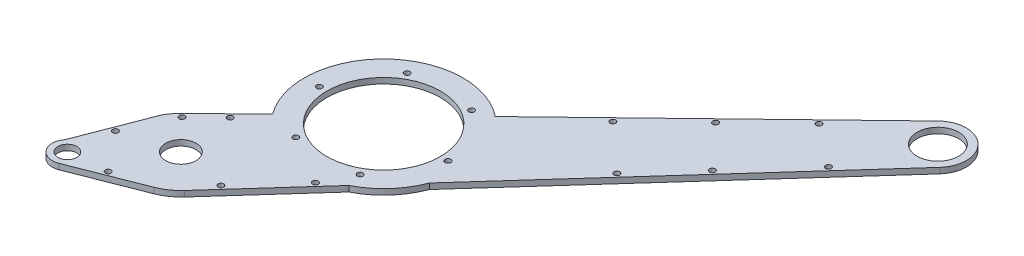
ISO-10303-21;
HEADER;
FILE_DESCRIPTION(('STEP AP214'),'2;1');
FILE_NAME('part.step','',(''),(''),'','','');
FILE_SCHEMA(('AUTOMOTIVE_DESIGN { 1 0 10303 214 1 1 1 1 }'));
ENDSEC;
DATA;
#1=APPLICATION_CONTEXT('core data for automotive mechanical design processes');
#2=APPLICATION_PROTOCOL_DEFINITION('international standard','automotive_design',2000,#1);
#3=PRODUCT_CONTEXT('',#1,'mechanical');
#4=PRODUCT('Part','Part','',(#3));
#5=PRODUCT_RELATED_PRODUCT_CATEGORY('part','',(#4));
#6=PRODUCT_DEFINITION_FORMATION('','',#4);
#7=PRODUCT_DEFINITION_CONTEXT('part definition',#1,'design');
#8=PRODUCT_DEFINITION('design','',#6,#7);
#9=PRODUCT_DEFINITION_SHAPE('','',#8);
#10=(LENGTH_UNIT() NAMED_UNIT(*) SI_UNIT(.MILLI.,.METRE.));
#11=(NAMED_UNIT(*) PLANE_ANGLE_UNIT() SI_UNIT($,.RADIAN.));
#12=(NAMED_UNIT(*) SI_UNIT($,.STERADIAN.) SOLID_ANGLE_UNIT());
#13=UNCERTAINTY_MEASURE_WITH_UNIT(LENGTH_MEASURE(1.E-05),#10,'distance_accuracy_value','');
#14=(GEOMETRIC_REPRESENTATION_CONTEXT(3) GLOBAL_UNCERTAINTY_ASSIGNED_CONTEXT((#13)) GLOBAL_UNIT_ASSIGNED_CONTEXT((#10,
#11,#12)) REPRESENTATION_CONTEXT('',''));
#15=CARTESIAN_POINT('',(0.,0.,0.));
#16=DIRECTION('',(0.,0.,1.));
#17=DIRECTION('',(1.,0.,0.));
#18=AXIS2_PLACEMENT_3D('',#15,#16,#17);
#19=CARTESIAN_POINT('',(40.6989429108541,3.,-66.4645055499677));
#20=DIRECTION('',(0.,-1.,0.));
#21=DIRECTION('',(0.,0.,1.));
#22=AXIS2_PLACEMENT_3D('',#19,#20,#21);
#23=CYLINDRICAL_SURFACE('',#22,42.);
#24=CARTESIAN_POINT('',(40.6989429108541,0.,-66.4645055499677));
#25=DIRECTION('',(0.,-1.,0.));
#26=DIRECTION('',(0.,0.,-1.));
#27=AXIS2_PLACEMENT_3D('',#24,#25,#26);
#28=CIRCLE('',#27,42.);
#29=CARTESIAN_POINT('',(6.95401125447119,0.,-41.4589144250603));
#30=VERTEX_POINT('',#29);
#31=CARTESIAN_POINT('',(66.8817826108157,0.,-99.3044036199391));
#32=VERTEX_POINT('',#31);
#33=EDGE_CURVE('E192',#30,#32,#28,.T.);
#34=ORIENTED_EDGE('',*,*,#33,.F.);
#35=DIRECTION('',(0.,-1.,0.));
#36=VECTOR('',#35,1.);
#37=CARTESIAN_POINT('',(6.95401125447119,3.,-41.4589144250603));
#38=LINE('',#37,#36);
#39=CARTESIAN_POINT('',(6.95401125447119,3.,-41.4589144250603));
#40=VERTEX_POINT('',#39);
#41=EDGE_CURVE('E191',#40,#30,#38,.T.);
#42=ORIENTED_EDGE('',*,*,#41,.F.);
#43=CARTESIAN_POINT('',(40.6989429108541,3.,-66.4645055499677));
#44=DIRECTION('',(0.,-1.,0.));
#45=DIRECTION('',(0.,0.,-1.));
#46=AXIS2_PLACEMENT_3D('',#43,#44,#45);
#47=CIRCLE('',#46,42.);
#48=CARTESIAN_POINT('',(66.8817826108157,3.,-99.3044036199391));
#49=VERTEX_POINT('',#48);
#50=EDGE_CURVE('E248',#40,#49,#47,.T.);
#51=ORIENTED_EDGE('',*,*,#50,.T.);
#52=DIRECTION('',(0.,-1.,0.));
#53=VECTOR('',#52,1.);
#54=CARTESIAN_POINT('',(66.8817826108157,3.,-99.3044036199391));
#55=LINE('',#54,#53);
#56=EDGE_CURVE('E11',#49,#32,#55,.T.);
#57=ORIENTED_EDGE('',*,*,#56,.T.);
#58=EDGE_LOOP('',(#34,#42,#51,#57));
#59=FACE_BOUND('',#58,.T.);
#60=ADVANCED_FACE('F38',(#59),#23,.T.);
#61=CARTESIAN_POINT('',(-17.3624071779741,3.,-17.9874071779741));
#62=DIRECTION('',(0.694496287118964,0.,0.719496287118964));
#63=DIRECTION('',(-0.719496287118964,0.,0.694496287118964));
#64=AXIS2_PLACEMENT_3D('',#61,#62,#63);
#65=PLANE('',#64);
#66=DIRECTION('',(0.719496287118964,0.,-0.694496287118963));
#67=VECTOR('',#66,1.);
#68=CARTESIAN_POINT('',(-17.3624071779741,0.,-17.9874071779741));
#69=LINE('',#68,#67);
#70=CARTESIAN_POINT('',(186.110074257621,0.,-214.389925742379));
#71=VERTEX_POINT('',#70);
#72=EDGE_CURVE('E194',#32,#71,#69,.T.);
#73=ORIENTED_EDGE('',*,*,#72,.F.);
#74=ORIENTED_EDGE('',*,*,#56,.F.);
#75=DIRECTION('',(0.719496287118964,0.,-0.694496287118963));
#76=VECTOR('',#75,1.);
#77=CARTESIAN_POINT('',(-17.3624071779741,3.,-17.9874071779741));
#78=LINE('',#77,#76);
#79=CARTESIAN_POINT('',(186.110074257621,3.,-214.389925742379));
#80=VERTEX_POINT('',#79);
#81=EDGE_CURVE('E106',#49,#80,#78,.T.);
#82=ORIENTED_EDGE('',*,*,#81,.T.);
#83=DIRECTION('',(0.,-1.,0.));
#84=VECTOR('',#83,1.);
#85=CARTESIAN_POINT('',(186.110074257621,3.,-214.389925742379));
#86=LINE('',#85,#84);
#87=EDGE_CURVE('E47',#80,#71,#86,.T.);
#88=ORIENTED_EDGE('',*,*,#87,.T.);
#89=EDGE_LOOP('',(#73,#74,#82,#88));
#90=FACE_BOUND('',#89,.T.);
#91=ADVANCED_FACE('F374',(#90),#65,.F.);
#92=CARTESIAN_POINT('',(196.527518564405,3.,-203.597481435595));
#93=DIRECTION('',(0.,-1.,0.));
#94=DIRECTION('',(0.,0.,1.));
#95=AXIS2_PLACEMENT_3D('',#92,#93,#94);
#96=CYLINDRICAL_SURFACE('',#95,15.);
#97=CARTESIAN_POINT('',(196.527518564405,0.,-203.597481435595));
#98=DIRECTION('',(0.,-1.,0.));
#99=DIRECTION('',(0.,0.,-1.));
#100=AXIS2_PLACEMENT_3D('',#97,#98,#99);
#101=CIRCLE('',#100,15.);
#102=CARTESIAN_POINT('',(207.681250795877,0.,-193.567812582206));
#103=VERTEX_POINT('',#102);
#104=EDGE_CURVE('E197',#71,#103,#101,.T.);
#105=ORIENTED_EDGE('',*,*,#104,.F.);
#106=ORIENTED_EDGE('',*,*,#87,.F.);
#107=CARTESIAN_POINT('',(196.527518564405,3.,-203.597481435595));
#108=DIRECTION('',(0.,-1.,0.));
#109=DIRECTION('',(0.,0.,-1.));
#110=AXIS2_PLACEMENT_3D('',#107,#108,#109);
#111=CIRCLE('',#110,15.);
#112=CARTESIAN_POINT('',(207.681250795877,3.,-193.567812582206));
#113=VERTEX_POINT('',#112);
#114=EDGE_CURVE('E388',#80,#113,#111,.T.);
#115=ORIENTED_EDGE('',*,*,#114,.T.);
#116=DIRECTION('',(0.,-1.,0.));
#117=VECTOR('',#116,1.);
#118=CARTESIAN_POINT('',(207.681250795877,3.,-193.567812582206));
#119=LINE('',#118,#117);
#120=EDGE_CURVE('E267',#113,#103,#119,.T.);
#121=ORIENTED_EDGE('',*,*,#120,.T.);
#122=EDGE_LOOP('',(#105,#106,#115,#121));
#123=FACE_BOUND('',#122,.T.);
#124=ADVANCED_FACE('F379',(#123),#96,.T.);
#125=CARTESIAN_POINT('',(18.5895537191193,3.,16.7161147556476));
#126=DIRECTION('',(0.743582148764772,0.,0.668644590225902));
#127=DIRECTION('',(-0.668644590225902,0.,0.743582148764772));
#128=AXIS2_PLACEMENT_3D('',#125,#126,#127);
#129=PLANE('',#128);
#130=DIRECTION('',(0.668644590225902,0.,-0.743582148764772));
#131=VECTOR('',#130,1.);
#132=CARTESIAN_POINT('',(18.5895537191193,0.,16.7161147556476));
#133=LINE('',#132,#131);
#134=CARTESIAN_POINT('',(79.9511725799714,0.,-51.5225355994269));
#135=VERTEX_POINT('',#134);
#136=EDGE_CURVE('E200',#135,#103,#133,.T.);
#137=ORIENTED_EDGE('',*,*,#136,.T.);
#138=ORIENTED_EDGE('',*,*,#120,.F.);
#139=DIRECTION('',(0.668644590225902,0.,-0.743582148764772));
#140=VECTOR('',#139,1.);
#141=CARTESIAN_POINT('',(18.5895537191193,3.,16.7161147556476));
#142=LINE('',#141,#140);
#143=CARTESIAN_POINT('',(79.9511725799714,3.,-51.5225355994269));
#144=VERTEX_POINT('',#143);
#145=EDGE_CURVE('E392',#144,#113,#142,.T.);
#146=ORIENTED_EDGE('',*,*,#145,.F.);
#147=DIRECTION('',(0.,-1.,0.));
#148=VECTOR('',#147,1.);
#149=CARTESIAN_POINT('',(79.9511725799714,3.,-51.5225355994269));
#150=LINE('',#149,#148);
#151=EDGE_CURVE('E264',#144,#135,#150,.T.);
#152=ORIENTED_EDGE('',*,*,#151,.T.);
#153=EDGE_LOOP('',(#137,#138,#146,#152));
#154=FACE_BOUND('',#153,.T.);
#155=ADVANCED_FACE('F391',(#154),#129,.T.);
#156=CARTESIAN_POINT('',(40.6989429108541,3.,-66.4645055499677));
#157=DIRECTION('',(0.,-1.,0.));
#158=DIRECTION('',(0.,0.,1.));
#159=AXIS2_PLACEMENT_3D('',#156,#157,#158);
#160=CYLINDRICAL_SURFACE('',#159,42.);
#161=CARTESIAN_POINT('',(40.6989429108541,0.,-66.4645055499677));
#162=DIRECTION('',(0.,-1.,0.));
#163=DIRECTION('',(0.,0.,-1.));
#164=AXIS2_PLACEMENT_3D('',#161,#162,#163);
#165=CIRCLE('',#164,42.);
#166=CARTESIAN_POINT('',(59.7110214741794,0.,-29.0139932877576));
#167=VERTEX_POINT('',#166);
#168=EDGE_CURVE('E202',#135,#167,#165,.T.);
#169=ORIENTED_EDGE('',*,*,#168,.F.);
#170=ORIENTED_EDGE('',*,*,#151,.F.);
#171=CARTESIAN_POINT('',(40.6989429108541,3.,-66.4645055499677));
#172=DIRECTION('',(0.,-1.,0.));
#173=DIRECTION('',(0.,0.,-1.));
#174=AXIS2_PLACEMENT_3D('',#171,#172,#173);
#175=CIRCLE('',#174,42.);
#176=CARTESIAN_POINT('',(59.7110214741794,3.,-29.0139932877576));
#177=VERTEX_POINT('',#176);
#178=EDGE_CURVE('E397',#144,#177,#175,.T.);
#179=ORIENTED_EDGE('',*,*,#178,.T.);
#180=DIRECTION('',(0.,-1.,0.));
#181=VECTOR('',#180,1.);
#182=CARTESIAN_POINT('',(59.7110214741794,3.,-29.0139932877576));
#183=LINE('',#182,#181);
#184=EDGE_CURVE('E261',#177,#167,#183,.T.);
#185=ORIENTED_EDGE('',*,*,#184,.T.);
#186=EDGE_LOOP('',(#169,#170,#179,#185));
#187=FACE_BOUND('',#186,.T.);
#188=ADVANCED_FACE('F396',(#187),#160,.T.);
#189=CARTESIAN_POINT('',(18.5895537191193,3.,16.7161147556476));
#190=DIRECTION('',(0.743582148764772,0.,0.668644590225902));
#191=DIRECTION('',(-0.668644590225902,0.,0.743582148764772));
#192=AXIS2_PLACEMENT_3D('',#189,#190,#191);
#193=PLANE('',#192);
#194=DIRECTION('',(0.668644590225902,0.,-0.743582148764772));
#195=VECTOR('',#194,1.);
#196=CARTESIAN_POINT('',(18.5895537191193,0.,16.7161147556476));
#197=LINE('',#196,#195);
#198=CARTESIAN_POINT('',(18.5895537191193,0.,16.7161147556476));
#199=VERTEX_POINT('',#198);
#200=EDGE_CURVE('E205',#199,#167,#197,.T.);
#201=ORIENTED_EDGE('',*,*,#200,.T.);
#202=ORIENTED_EDGE('',*,*,#184,.F.);
#203=DIRECTION('',(0.668644590225902,0.,-0.743582148764772));
#204=VECTOR('',#203,1.);
#205=CARTESIAN_POINT('',(18.5895537191193,3.,16.7161147556476));
#206=LINE('',#205,#204);
#207=CARTESIAN_POINT('',(18.5895537191193,3.,16.7161147556476));
#208=VERTEX_POINT('',#207);
#209=EDGE_CURVE('E405',#208,#177,#206,.T.);
#210=ORIENTED_EDGE('',*,*,#209,.F.);
#211=DIRECTION('',(0.,-1.,0.));
#212=VECTOR('',#211,1.);
#213=CARTESIAN_POINT('',(18.5895537191193,3.,16.7161147556476));
#214=LINE('',#213,#212);
#215=EDGE_CURVE('E258',#208,#199,#214,.T.);
#216=ORIENTED_EDGE('',*,*,#215,.T.);
#217=EDGE_LOOP('',(#201,#202,#210,#216));
#218=FACE_BOUND('',#217,.T.);
#219=ADVANCED_FACE('F402',(#218),#193,.T.);
#220=CARTESIAN_POINT('',(0.,3.,0.));
#221=DIRECTION('',(0.,-1.,0.));
#222=DIRECTION('',(0.,0.,1.));
#223=AXIS2_PLACEMENT_3D('',#220,#221,#222);
#224=CYLINDRICAL_SURFACE('',#223,25.);
#225=CARTESIAN_POINT('',(0.,0.,0.));
#226=DIRECTION('',(0.,-1.,0.));
#227=DIRECTION('',(0.,0.,-1.));
#228=AXIS2_PLACEMENT_3D('',#225,#226,#227);
#229=CIRCLE('',#228,25.);
#230=CARTESIAN_POINT('',(9.113159771314,0.,23.2798264379807));
#231=VERTEX_POINT('',#230);
#232=EDGE_CURVE('E207',#199,#231,#229,.T.);
#233=ORIENTED_EDGE('',*,*,#232,.F.);
#234=ORIENTED_EDGE('',*,*,#215,.F.);
#235=CARTESIAN_POINT('',(0.,3.,0.));
#236=DIRECTION('',(0.,-1.,0.));
#237=DIRECTION('',(0.,0.,-1.));
#238=AXIS2_PLACEMENT_3D('',#235,#236,#237);
#239=CIRCLE('',#238,25.);
#240=CARTESIAN_POINT('',(9.113159771314,3.,23.2798264379807));
#241=VERTEX_POINT('',#240);
#242=EDGE_CURVE('E141',#208,#241,#239,.T.);
#243=ORIENTED_EDGE('',*,*,#242,.T.);
#244=DIRECTION('',(0.,-1.,0.));
#245=VECTOR('',#244,1.);
#246=CARTESIAN_POINT('',(9.113159771314,3.,23.2798264379807));
#247=LINE('',#246,#245);
#248=EDGE_CURVE('E255',#241,#231,#247,.T.);
#249=ORIENTED_EDGE('',*,*,#248,.T.);
#250=EDGE_LOOP('',(#233,#234,#243,#249));
#251=FACE_BOUND('',#250,.T.);
#252=ADVANCED_FACE('F408',(#251),#224,.T.);
#253=CARTESIAN_POINT('',(9.11315977131401,3.,23.2798264379807));
#254=DIRECTION('',(0.36452639085256,0.,0.931193057519227));
#255=DIRECTION('',(-0.931193057519227,0.,0.36452639085256));
#256=AXIS2_PLACEMENT_3D('',#253,#254,#255);
#257=PLANE('',#256);
#258=DIRECTION('',(0.931193057519227,0.,-0.36452639085256));
#259=VECTOR('',#258,1.);
#260=CARTESIAN_POINT('',(9.11315977131401,0.,23.2798264379807));
#261=LINE('',#260,#259);
#262=CARTESIAN_POINT('',(-27.0837888731795,0.,37.4495444601538));
#263=VERTEX_POINT('',#262);
#264=EDGE_CURVE('E210',#263,#231,#261,.T.);
#265=ORIENTED_EDGE('',*,*,#264,.T.);
#266=ORIENTED_EDGE('',*,*,#248,.F.);
#267=DIRECTION('',(0.931193057519227,0.,-0.36452639085256));
#268=VECTOR('',#267,1.);
#269=CARTESIAN_POINT('',(9.11315977131401,3.,23.2798264379807));
#270=LINE('',#269,#268);
#271=CARTESIAN_POINT('',(-27.0837888731795,3.,37.4495444601538));
#272=VERTEX_POINT('',#271);
#273=EDGE_CURVE('E156',#272,#241,#270,.T.);
#274=ORIENTED_EDGE('',*,*,#273,.F.);
#275=DIRECTION('',(0.,-1.,0.));
#276=VECTOR('',#275,1.);
#277=CARTESIAN_POINT('',(-27.0837888731795,3.,37.4495444601538));
#278=LINE('',#277,#276);
#279=EDGE_CURVE('E252',#272,#263,#278,.T.);
#280=ORIENTED_EDGE('',*,*,#279,.T.);
#281=EDGE_LOOP('',(#265,#266,#274,#280));
#282=FACE_BOUND('',#281,.T.);
#283=ADVANCED_FACE('F412',(#282),#257,.T.);
#284=CARTESIAN_POINT('',(-30.,3.,30.));
#285=DIRECTION('',(0.,-1.,0.));
#286=DIRECTION('',(0.,0.,1.));
#287=AXIS2_PLACEMENT_3D('',#284,#285,#286);
#288=CYLINDRICAL_SURFACE('',#287,7.99999999999999);
#289=CARTESIAN_POINT('',(-30.,0.,30.));
#290=DIRECTION('',(0.,-1.,0.));
#291=DIRECTION('',(0.,0.,-1.));
#292=AXIS2_PLACEMENT_3D('',#289,#290,#291);
#293=CIRCLE('',#292,7.99999999999999);
#294=CARTESIAN_POINT('',(-36.2449979983984,0.,25.));
#295=VERTEX_POINT('',#294);
#296=EDGE_CURVE('E212',#263,#295,#293,.T.);
#297=ORIENTED_EDGE('',*,*,#296,.F.);
#298=ORIENTED_EDGE('',*,*,#279,.F.);
#299=CARTESIAN_POINT('',(-30.,3.,30.));
#300=DIRECTION('',(0.,-1.,0.));
#301=DIRECTION('',(0.,0.,-1.));
#302=AXIS2_PLACEMENT_3D('',#299,#300,#301);
#303=CIRCLE('',#302,7.99999999999999);
#304=CARTESIAN_POINT('',(-36.2449979983984,3.,25.));
#305=VERTEX_POINT('',#304);
#306=EDGE_CURVE('E154',#272,#305,#303,.T.);
#307=ORIENTED_EDGE('',*,*,#306,.T.);
#308=DIRECTION('',(0.,-1.,0.));
#309=VECTOR('',#308,1.);
#310=CARTESIAN_POINT('',(-36.2449979983984,3.,25.));
#311=LINE('',#310,#309);
#312=EDGE_CURVE('E148',#305,#295,#311,.T.);
#313=ORIENTED_EDGE('',*,*,#312,.T.);
#314=EDGE_LOOP('',(#297,#298,#307,#313));
#315=FACE_BOUND('',#314,.T.);
#316=ADVANCED_FACE('F415',(#315),#288,.T.);
#317=CARTESIAN_POINT('',(-23.1346555993659,3.,-8.93719329089938));
#318=DIRECTION('',(0.932814350448732,0.,0.360357305457945));
#319=DIRECTION('',(-0.360357305457945,0.,0.932814350448732));
#320=AXIS2_PLACEMENT_3D('',#317,#318,#319);
#321=PLANE('',#320);
#322=DIRECTION('',(0.360357305457945,0.,-0.932814350448732));
#323=VECTOR('',#322,1.);
#324=CARTESIAN_POINT('',(-23.1346555993659,0.,-8.93719329089938));
#325=LINE('',#324,#323);
#326=CARTESIAN_POINT('',(-22.,0.,-11.8743420870379));
#327=VERTEX_POINT('',#326);
#328=EDGE_CURVE('E215',#295,#327,#325,.T.);
#329=ORIENTED_EDGE('',*,*,#328,.F.);
#330=ORIENTED_EDGE('',*,*,#312,.F.);
#331=DIRECTION('',(0.360357305457945,0.,-0.932814350448732));
#332=VECTOR('',#331,1.);
#333=CARTESIAN_POINT('',(-23.1346555993659,3.,-8.93719329089938));
#334=LINE('',#333,#332);
#335=CARTESIAN_POINT('',(-22.,3.,-11.8743420870379));
#336=VERTEX_POINT('',#335);
#337=EDGE_CURVE('E137',#305,#336,#334,.T.);
#338=ORIENTED_EDGE('',*,*,#337,.T.);
#339=DIRECTION('',(0.,-1.,0.));
#340=VECTOR('',#339,1.);
#341=CARTESIAN_POINT('',(-22.,3.,-11.8743420870379));
#342=LINE('',#341,#340);
#343=EDGE_CURVE('E143',#336,#327,#342,.T.);
#344=ORIENTED_EDGE('',*,*,#343,.T.);
#345=EDGE_LOOP('',(#329,#330,#338,#344));
#346=FACE_BOUND('',#345,.T.);
#347=ADVANCED_FACE('F151',(#346),#321,.F.);
#348=CARTESIAN_POINT('',(-17.3624071779741,0.,-17.9874071779741));
#349=VERTEX_POINT('',#348);
#350=EDGE_CURVE('E145',#327,#349,#229,.T.);
#351=ORIENTED_EDGE('',*,*,#350,.F.);
#352=ORIENTED_EDGE('',*,*,#343,.F.);
#353=CARTESIAN_POINT('',(-17.3624071779741,3.,-17.9874071779741));
#354=VERTEX_POINT('',#353);
#355=EDGE_CURVE('E132',#336,#354,#239,.T.);
#356=ORIENTED_EDGE('',*,*,#355,.T.);
#357=DIRECTION('',(0.,-1.,0.));
#358=VECTOR('',#357,1.);
#359=CARTESIAN_POINT('',(-17.3624071779741,3.,-17.9874071779741));
#360=LINE('',#359,#358);
#361=EDGE_CURVE('E149',#354,#349,#360,.T.);
#362=ORIENTED_EDGE('',*,*,#361,.T.);
#363=EDGE_LOOP('',(#351,#352,#356,#362));
#364=FACE_BOUND('',#363,.T.);
#365=ADVANCED_FACE('F144',(#364),#224,.T.);
#366=CARTESIAN_POINT('',(0.,3.,0.));
#367=DIRECTION('',(0.,-1.,0.));
#368=DIRECTION('',(0.,0.,1.));
#369=AXIS2_PLACEMENT_3D('',#366,#367,#368);
#370=CYLINDRICAL_SURFACE('',#369,8.);
#371=CARTESIAN_POINT('',(0.,3.,0.));
#372=DIRECTION('',(0.,-1.,0.));
#373=DIRECTION('',(0.,0.,-1.));
#374=AXIS2_PLACEMENT_3D('',#371,#372,#373);
#375=CIRCLE('',#374,8.);
#376=CARTESIAN_POINT('',(0.,3.,-8.));
#377=VERTEX_POINT('',#376);
#378=EDGE_CURVE('E185',#377,#377,#375,.T.);
#379=ORIENTED_EDGE('',*,*,#378,.F.);
#380=EDGE_LOOP('',(#379));
#381=FACE_BOUND('',#380,.T.);
#382=CARTESIAN_POINT('',(0.,0.,0.));
#383=DIRECTION('',(0.,-1.,0.));
#384=DIRECTION('',(0.,0.,-1.));
#385=AXIS2_PLACEMENT_3D('',#382,#383,#384);
#386=CIRCLE('',#385,8.);
#387=CARTESIAN_POINT('',(0.,0.,-8.));
#388=VERTEX_POINT('',#387);
#389=EDGE_CURVE('E242',#388,#388,#386,.T.);
#390=ORIENTED_EDGE('',*,*,#389,.T.);
#391=EDGE_LOOP('',(#390));
#392=FACE_BOUND('',#391,.T.);
#393=ADVANCED_FACE('F610',(#381,#392),#370,.F.);
#394=CARTESIAN_POINT('',(6.69894291085409,3.,-66.4645055499677));
#395=DIRECTION('',(0.,-1.,0.));
#396=DIRECTION('',(0.,0.,1.));
#397=AXIS2_PLACEMENT_3D('',#394,#395,#396);
#398=CYLINDRICAL_SURFACE('',#397,1.5);
#399=CARTESIAN_POINT('',(6.69894291085409,3.,-66.4645055499677));
#400=DIRECTION('',(0.,-1.,0.));
#401=DIRECTION('',(0.,0.,-1.));
#402=AXIS2_PLACEMENT_3D('',#399,#400,#401);
#403=CIRCLE('',#402,1.5);
#404=CARTESIAN_POINT('',(6.69894291085409,3.,-67.9645055499677));
#405=VERTEX_POINT('',#404);
#406=EDGE_CURVE('E182',#405,#405,#403,.T.);
#407=ORIENTED_EDGE('',*,*,#406,.F.);
#408=EDGE_LOOP('',(#407));
#409=FACE_BOUND('',#408,.T.);
#410=CARTESIAN_POINT('',(6.69894291085409,0.,-66.4645055499677));
#411=DIRECTION('',(0.,-1.,0.));
#412=DIRECTION('',(0.,0.,-1.));
#413=AXIS2_PLACEMENT_3D('',#410,#411,#412);
#414=CIRCLE('',#413,1.5);
#415=CARTESIAN_POINT('',(6.69894291085409,0.,-67.9645055499677));
#416=VERTEX_POINT('',#415);
#417=EDGE_CURVE('E239',#416,#416,#414,.T.);
#418=ORIENTED_EDGE('',*,*,#417,.T.);
#419=EDGE_LOOP('',(#418));
#420=FACE_BOUND('',#419,.T.);
#421=ADVANCED_FACE('F619',(#409,#420),#398,.F.);
#422=CARTESIAN_POINT('',(57.6989429108538,3.,-95.9093692786387));
#423=DIRECTION('',(0.,-1.,0.));
#424=DIRECTION('',(0.,0.,1.));
#425=AXIS2_PLACEMENT_3D('',#422,#423,#424);
#426=CYLINDRICAL_SURFACE('',#425,1.5);
#427=CARTESIAN_POINT('',(57.6989429108538,3.,-95.9093692786387));
#428=DIRECTION('',(0.,-1.,0.));
#429=DIRECTION('',(0.,0.,-1.));
#430=AXIS2_PLACEMENT_3D('',#427,#428,#429);
#431=CIRCLE('',#430,1.5);
#432=CARTESIAN_POINT('',(57.6989429108538,3.,-97.4093692786387));
#433=VERTEX_POINT('',#432);
#434=EDGE_CURVE('E179',#433,#433,#431,.T.);
#435=ORIENTED_EDGE('',*,*,#434,.F.);
#436=EDGE_LOOP('',(#435));
#437=FACE_BOUND('',#436,.T.);
#438=CARTESIAN_POINT('',(57.6989429108538,0.,-95.9093692786387));
#439=DIRECTION('',(0.,-1.,0.));
#440=DIRECTION('',(0.,0.,-1.));
#441=AXIS2_PLACEMENT_3D('',#438,#439,#440);
#442=CIRCLE('',#441,1.5);
#443=CARTESIAN_POINT('',(57.6989429108538,0.,-97.4093692786387));
#444=VERTEX_POINT('',#443);
#445=EDGE_CURVE('E236',#444,#444,#442,.T.);
#446=ORIENTED_EDGE('',*,*,#445,.T.);
#447=EDGE_LOOP('',(#446));
#448=FACE_BOUND('',#447,.T.);
#449=ADVANCED_FACE('F629',(#437,#448),#426,.F.);
#450=CARTESIAN_POINT('',(23.6989429108537,3.,-95.9093692786384));
#451=DIRECTION('',(0.,-1.,0.));
#452=DIRECTION('',(0.,0.,1.));
#453=AXIS2_PLACEMENT_3D('',#450,#451,#452);
#454=CYLINDRICAL_SURFACE('',#453,1.5);
#455=CARTESIAN_POINT('',(23.6989429108537,3.,-95.9093692786384));
#456=DIRECTION('',(0.,-1.,0.));
#457=DIRECTION('',(0.,0.,-1.));
#458=AXIS2_PLACEMENT_3D('',#455,#456,#457);
#459=CIRCLE('',#458,1.5);
#460=CARTESIAN_POINT('',(23.6989429108537,3.,-97.4093692786384));
#461=VERTEX_POINT('',#460);
#462=EDGE_CURVE('E176',#461,#461,#459,.T.);
#463=ORIENTED_EDGE('',*,*,#462,.F.);
#464=EDGE_LOOP('',(#463));
#465=FACE_BOUND('',#464,.T.);
#466=CARTESIAN_POINT('',(23.6989429108537,0.,-95.9093692786384));
#467=DIRECTION('',(0.,-1.,0.));
#468=DIRECTION('',(0.,0.,-1.));
#469=AXIS2_PLACEMENT_3D('',#466,#467,#468);
#470=CIRCLE('',#469,1.5);
#471=CARTESIAN_POINT('',(23.6989429108537,0.,-97.4093692786384));
#472=VERTEX_POINT('',#471);
#473=EDGE_CURVE('E233',#472,#472,#470,.T.);
#474=ORIENTED_EDGE('',*,*,#473,.T.);
#475=EDGE_LOOP('',(#474));
#476=FACE_BOUND('',#475,.T.);
#477=ADVANCED_FACE('F639',(#465,#476),#454,.F.);
#478=CARTESIAN_POINT('',(23.6989429108542,3.,-37.0196418212967));
#479=DIRECTION('',(0.,-1.,0.));
#480=DIRECTION('',(0.,0.,1.));
#481=AXIS2_PLACEMENT_3D('',#478,#479,#480);
#482=CYLINDRICAL_SURFACE('',#481,1.5);
#483=CARTESIAN_POINT('',(23.6989429108542,3.,-37.0196418212967));
#484=DIRECTION('',(0.,-1.,0.));
#485=DIRECTION('',(0.,0.,-1.));
#486=AXIS2_PLACEMENT_3D('',#483,#484,#485);
#487=CIRCLE('',#486,1.5);
#488=CARTESIAN_POINT('',(23.6989429108542,3.,-38.5196418212967));
#489=VERTEX_POINT('',#488);
#490=EDGE_CURVE('E173',#489,#489,#487,.T.);
#491=ORIENTED_EDGE('',*,*,#490,.F.);
#492=EDGE_LOOP('',(#491));
#493=FACE_BOUND('',#492,.T.);
#494=CARTESIAN_POINT('',(23.6989429108542,0.,-37.0196418212967));
#495=DIRECTION('',(0.,-1.,0.));
#496=DIRECTION('',(0.,0.,-1.));
#497=AXIS2_PLACEMENT_3D('',#494,#495,#496);
#498=CIRCLE('',#497,1.5);
#499=CARTESIAN_POINT('',(23.6989429108542,0.,-38.5196418212967));
#500=VERTEX_POINT('',#499);
#501=EDGE_CURVE('E230',#500,#500,#498,.T.);
#502=ORIENTED_EDGE('',*,*,#501,.T.);
#503=EDGE_LOOP('',(#502));
#504=FACE_BOUND('',#503,.T.);
#505=ADVANCED_FACE('F649',(#493,#504),#482,.F.);
#506=CARTESIAN_POINT('',(57.6989429108542,3.,-37.0196418212968));
#507=DIRECTION('',(0.,-1.,0.));
#508=DIRECTION('',(0.,0.,1.));
#509=AXIS2_PLACEMENT_3D('',#506,#507,#508);
#510=CYLINDRICAL_SURFACE('',#509,1.5);
#511=CARTESIAN_POINT('',(57.6989429108542,3.,-37.0196418212968));
#512=DIRECTION('',(0.,-1.,0.));
#513=DIRECTION('',(0.,0.,-1.));
#514=AXIS2_PLACEMENT_3D('',#511,#512,#513);
#515=CIRCLE('',#514,1.5);
#516=CARTESIAN_POINT('',(57.6989429108542,3.,-38.5196418212968));
#517=VERTEX_POINT('',#516);
#518=EDGE_CURVE('E170',#517,#517,#515,.T.);
#519=ORIENTED_EDGE('',*,*,#518,.F.);
#520=EDGE_LOOP('',(#519));
#521=FACE_BOUND('',#520,.T.);
#522=CARTESIAN_POINT('',(57.6989429108542,0.,-37.0196418212968));
#523=DIRECTION('',(0.,-1.,0.));
#524=DIRECTION('',(0.,0.,-1.));
#525=AXIS2_PLACEMENT_3D('',#522,#523,#524);
#526=CIRCLE('',#525,1.5);
#527=CARTESIAN_POINT('',(57.6989429108542,0.,-38.5196418212968));
#528=VERTEX_POINT('',#527);
#529=EDGE_CURVE('E227',#528,#528,#526,.T.);
#530=ORIENTED_EDGE('',*,*,#529,.T.);
#531=EDGE_LOOP('',(#530));
#532=FACE_BOUND('',#531,.T.);
#533=ADVANCED_FACE('F659',(#521,#532),#510,.F.);
#534=CARTESIAN_POINT('',(74.6989429108541,3.,-66.4645055499679));
#535=DIRECTION('',(0.,-1.,0.));
#536=DIRECTION('',(0.,0.,1.));
#537=AXIS2_PLACEMENT_3D('',#534,#535,#536);
#538=CYLINDRICAL_SURFACE('',#537,1.49999999999999);
#539=CARTESIAN_POINT('',(74.6989429108541,3.,-66.4645055499679));
#540=DIRECTION('',(0.,-1.,0.));
#541=DIRECTION('',(0.,0.,-1.));
#542=AXIS2_PLACEMENT_3D('',#539,#540,#541);
#543=CIRCLE('',#542,1.49999999999999);
#544=CARTESIAN_POINT('',(74.6989429108541,3.,-67.9645055499679));
#545=VERTEX_POINT('',#544);
#546=EDGE_CURVE('E167',#545,#545,#543,.T.);
#547=ORIENTED_EDGE('',*,*,#546,.F.);
#548=EDGE_LOOP('',(#547));
#549=FACE_BOUND('',#548,.T.);
#550=CARTESIAN_POINT('',(74.6989429108541,0.,-66.4645055499679));
#551=DIRECTION('',(0.,-1.,0.));
#552=DIRECTION('',(0.,0.,-1.));
#553=AXIS2_PLACEMENT_3D('',#550,#551,#552);
#554=CIRCLE('',#553,1.49999999999999);
#555=CARTESIAN_POINT('',(74.6989429108541,0.,-67.9645055499679));
#556=VERTEX_POINT('',#555);
#557=EDGE_CURVE('E224',#556,#556,#554,.T.);
#558=ORIENTED_EDGE('',*,*,#557,.T.);
#559=EDGE_LOOP('',(#558));
#560=FACE_BOUND('',#559,.T.);
#561=ADVANCED_FACE('F669',(#549,#560),#538,.F.);
#562=CARTESIAN_POINT('',(40.6989429108541,3.,-66.4645055499677));
#563=DIRECTION('',(0.,-1.,0.));
#564=DIRECTION('',(0.,0.,1.));
#565=AXIS2_PLACEMENT_3D('',#562,#563,#564);
#566=CYLINDRICAL_SURFACE('',#565,30.);
#567=CARTESIAN_POINT('',(40.6989429108541,3.,-66.4645055499677));
#568=DIRECTION('',(0.,-1.,0.));
#569=DIRECTION('',(0.,0.,-1.));
#570=AXIS2_PLACEMENT_3D('',#567,#568,#569);
#571=CIRCLE('',#570,30.);
#572=CARTESIAN_POINT('',(40.6989429108541,3.,-96.4645055499677));
#573=VERTEX_POINT('',#572);
#574=EDGE_CURVE('E164',#573,#573,#571,.T.);
#575=ORIENTED_EDGE('',*,*,#574,.F.);
#576=EDGE_LOOP('',(#575));
#577=FACE_BOUND('',#576,.T.);
#578=CARTESIAN_POINT('',(40.6989429108541,0.,-66.4645055499677));
#579=DIRECTION('',(0.,-1.,0.));
#580=DIRECTION('',(0.,0.,-1.));
#581=AXIS2_PLACEMENT_3D('',#578,#579,#580);
#582=CIRCLE('',#581,30.);
#583=CARTESIAN_POINT('',(40.6989429108541,0.,-96.4645055499677));
#584=VERTEX_POINT('',#583);
#585=EDGE_CURVE('E221',#584,#584,#582,.T.);
#586=ORIENTED_EDGE('',*,*,#585,.T.);
#587=EDGE_LOOP('',(#586));
#588=FACE_BOUND('',#587,.T.);
#589=ADVANCED_FACE('F679',(#577,#588),#566,.F.);
#590=CARTESIAN_POINT('',(196.527518564405,3.,-203.597481435595));
#591=DIRECTION('',(0.,-1.,0.));
#592=DIRECTION('',(0.,0.,1.));
#593=AXIS2_PLACEMENT_3D('',#590,#591,#592);
#594=CYLINDRICAL_SURFACE('',#593,11.);
#595=CARTESIAN_POINT('',(196.527518564405,3.,-203.597481435595));
#596=DIRECTION('',(0.,-1.,0.));
#597=DIRECTION('',(0.,0.,-1.));
#598=AXIS2_PLACEMENT_3D('',#595,#596,#597);
#599=CIRCLE('',#598,11.);
#600=CARTESIAN_POINT('',(196.527518564405,3.,-214.597481435595));
#601=VERTEX_POINT('',#600);
#602=EDGE_CURVE('E161',#601,#601,#599,.T.);
#603=ORIENTED_EDGE('',*,*,#602,.F.);
#604=EDGE_LOOP('',(#603));
#605=FACE_BOUND('',#604,.T.);
#606=CARTESIAN_POINT('',(196.527518564405,0.,-203.597481435595));
#607=DIRECTION('',(0.,-1.,0.));
#608=DIRECTION('',(0.,0.,-1.));
#609=AXIS2_PLACEMENT_3D('',#606,#607,#608);
#610=CIRCLE('',#609,11.);
#611=CARTESIAN_POINT('',(196.527518564405,0.,-214.597481435595));
#612=VERTEX_POINT('',#611);
#613=EDGE_CURVE('E218',#612,#612,#610,.T.);
#614=ORIENTED_EDGE('',*,*,#613,.T.);
#615=EDGE_LOOP('',(#614));
#616=FACE_BOUND('',#615,.T.);
#617=ADVANCED_FACE('F369',(#605,#616),#594,.F.);
#618=CARTESIAN_POINT('',(-17.3624071779741,3.,-17.9874071779741));
#619=DIRECTION('',(0.694496287118964,0.,0.719496287118964));
#620=DIRECTION('',(-0.719496287118964,0.,0.694496287118964));
#621=AXIS2_PLACEMENT_3D('',#618,#619,#620);
#622=PLANE('',#621);
#623=DIRECTION('',(0.719496287118964,0.,-0.694496287118963));
#624=VECTOR('',#623,1.);
#625=CARTESIAN_POINT('',(-17.3624071779741,0.,-17.9874071779741));
#626=LINE('',#625,#624);
#627=EDGE_CURVE('E94',#349,#30,#626,.T.);
#628=ORIENTED_EDGE('',*,*,#627,.F.);
#629=ORIENTED_EDGE('',*,*,#361,.F.);
#630=DIRECTION('',(0.719496287118964,0.,-0.694496287118963));
#631=VECTOR('',#630,1.);
#632=CARTESIAN_POINT('',(-17.3624071779741,3.,-17.9874071779741));
#633=LINE('',#632,#631);
#634=EDGE_CURVE('E56',#354,#40,#633,.T.);
#635=ORIENTED_EDGE('',*,*,#634,.T.);
#636=ORIENTED_EDGE('',*,*,#41,.T.);
#637=EDGE_LOOP('',(#628,#629,#635,#636));
#638=FACE_BOUND('',#637,.T.);
#639=ADVANCED_FACE('F360',(#638),#622,.F.);
#640=CARTESIAN_POINT('',(-30.,3.,30.));
#641=DIRECTION('',(0.,-1.,0.));
#642=DIRECTION('',(0.,0.,1.));
#643=AXIS2_PLACEMENT_3D('',#640,#641,#642);
#644=CYLINDRICAL_SURFACE('',#643,5.);
#645=CARTESIAN_POINT('',(-30.,3.,30.));
#646=DIRECTION('',(0.,-1.,0.));
#647=DIRECTION('',(0.,0.,-1.));
#648=AXIS2_PLACEMENT_3D('',#645,#646,#647);
#649=CIRCLE('',#648,5.);
#650=CARTESIAN_POINT('',(-30.,3.,25.));
#651=VERTEX_POINT('',#650);
#652=EDGE_CURVE('E188',#651,#651,#649,.T.);
#653=ORIENTED_EDGE('',*,*,#652,.F.);
#654=EDGE_LOOP('',(#653));
#655=FACE_BOUND('',#654,.T.);
#656=CARTESIAN_POINT('',(-30.,0.,30.));
#657=DIRECTION('',(0.,-1.,0.));
#658=DIRECTION('',(0.,0.,-1.));
#659=AXIS2_PLACEMENT_3D('',#656,#657,#658);
#660=CIRCLE('',#659,5.);
#661=CARTESIAN_POINT('',(-30.,0.,25.));
#662=VERTEX_POINT('',#661);
#663=EDGE_CURVE('E245',#662,#662,#660,.T.);
#664=ORIENTED_EDGE('',*,*,#663,.T.);
#665=EDGE_LOOP('',(#664));
#666=FACE_BOUND('',#665,.T.);
#667=ADVANCED_FACE('F358',(#655,#666),#644,.F.);
#668=CARTESIAN_POINT('',(0.,3.,0.));
#669=DIRECTION('',(0.,1.,0.));
#670=DIRECTION('',(0.,0.,-1.));
#671=AXIS2_PLACEMENT_3D('',#668,#669,#670);
#672=PLANE('',#671);
#673=CARTESIAN_POINT('',(155.700523111304,3.,-181.562347911993));
#674=DIRECTION('',(0.,-1.,0.));
#675=DIRECTION('',(0.,0.,-1.));
#676=AXIS2_PLACEMENT_3D('',#673,#674,#675);
#677=CIRCLE('',#676,1.5);
#678=CARTESIAN_POINT('',(155.700523111304,3.,-183.062347911993));
#679=VERTEX_POINT('',#678);
#680=EDGE_CURVE('E427',#679,#679,#677,.T.);
#681=ORIENTED_EDGE('',*,*,#680,.T.);
#682=EDGE_LOOP('',(#681));
#683=FACE_BOUND('',#682,.T.);
#684=CARTESIAN_POINT('',(148.934969969465,3.,-131.976518296959));
#685=DIRECTION('',(0.,-1.,0.));
#686=DIRECTION('',(0.,0.,-1.));
#687=AXIS2_PLACEMENT_3D('',#684,#685,#686);
#688=CIRCLE('',#687,1.5);
#689=CARTESIAN_POINT('',(148.934969969465,3.,-133.476518296959));
#690=VERTEX_POINT('',#689);
#691=EDGE_CURVE('E435',#690,#690,#688,.T.);
#692=ORIENTED_EDGE('',*,*,#691,.T.);
#693=EDGE_LOOP('',(#692));
#694=FACE_BOUND('',#693,.T.);
#695=CARTESIAN_POINT('',(177.993903369089,3.,-164.29219758901));
#696=DIRECTION('',(0.,-1.,0.));
#697=DIRECTION('',(0.,0.,-1.));
#698=AXIS2_PLACEMENT_3D('',#695,#696,#697);
#699=CIRCLE('',#698,1.5);
#700=CARTESIAN_POINT('',(177.993903369089,3.,-165.79219758901));
#701=VERTEX_POINT('',#700);
#702=EDGE_CURVE('E438',#701,#701,#699,.T.);
#703=ORIENTED_EDGE('',*,*,#702,.T.);
#704=EDGE_LOOP('',(#703));
#705=FACE_BOUND('',#704,.T.);
#706=CARTESIAN_POINT('',(125.057017775256,3.,-105.422472604801));
#707=DIRECTION('',(0.,-1.,0.));
#708=DIRECTION('',(0.,0.,-1.));
#709=AXIS2_PLACEMENT_3D('',#706,#707,#708);
#710=CIRCLE('',#709,1.5);
#711=CARTESIAN_POINT('',(125.057017775256,3.,-106.922472604801));
#712=VERTEX_POINT('',#711);
#713=EDGE_CURVE('E441',#712,#712,#710,.T.);
#714=ORIENTED_EDGE('',*,*,#713,.T.);
#715=EDGE_LOOP('',(#714));
#716=FACE_BOUND('',#715,.T.);
#717=CARTESIAN_POINT('',(100.268681967236,3.,-128.056570951177));
#718=DIRECTION('',(0.,-1.,0.));
#719=DIRECTION('',(0.,0.,-1.));
#720=AXIS2_PLACEMENT_3D('',#717,#718,#719);
#721=CIRCLE('',#720,1.5);
#722=CARTESIAN_POINT('',(100.268681967236,3.,-129.556570951177));
#723=VERTEX_POINT('',#722);
#724=EDGE_CURVE('E423',#723,#723,#721,.T.);
#725=ORIENTED_EDGE('',*,*,#724,.T.);
#726=EDGE_LOOP('',(#725));
#727=FACE_BOUND('',#726,.T.);
#728=CARTESIAN_POINT('',(127.883379130551,3.,-154.711753185168));
#729=DIRECTION('',(0.,-1.,0.));
#730=DIRECTION('',(0.,0.,-1.));
#731=AXIS2_PLACEMENT_3D('',#728,#729,#730);
#732=CIRCLE('',#731,1.5);
#733=CARTESIAN_POINT('',(127.883379130551,3.,-156.211753185168));
#734=VERTEX_POINT('',#733);
#735=EDGE_CURVE('E426',#734,#734,#732,.T.);
#736=ORIENTED_EDGE('',*,*,#735,.T.);
#737=EDGE_LOOP('',(#736));
#738=FACE_BOUND('',#737,.T.);
#739=CARTESIAN_POINT('',(-2.65653487277074,3.,-28.7076483423792));
#740=DIRECTION('',(0.,-1.,0.));
#741=DIRECTION('',(0.,0.,-1.));
#742=AXIS2_PLACEMENT_3D('',#739,#740,#741);
#743=CIRCLE('',#742,1.5);
#744=CARTESIAN_POINT('',(-2.65653487277074,3.,-30.2076483423792));
#745=VERTEX_POINT('',#744);
#746=EDGE_CURVE('E430',#745,#745,#743,.T.);
#747=ORIENTED_EDGE('',*,*,#746,.T.);
#748=EDGE_LOOP('',(#747));
#749=FACE_BOUND('',#748,.T.);
#750=CARTESIAN_POINT('',(-15.6261664601767,3.,-16.1886664601767));
#751=DIRECTION('',(0.,-1.,0.));
#752=DIRECTION('',(0.,0.,-1.));
#753=AXIS2_PLACEMENT_3D('',#750,#751,#752);
#754=CIRCLE('',#753,1.5);
#755=CARTESIAN_POINT('',(-15.6261664601767,3.,-17.6886664601767));
#756=VERTEX_POINT('',#755);
#757=EDGE_CURVE('E276',#756,#756,#754,.T.);
#758=ORIENTED_EDGE('',*,*,#757,.T.);
#759=EDGE_LOOP('',(#758));
#760=FACE_BOUND('',#759,.T.);
#761=CARTESIAN_POINT('',(49.6009841968948,3.,-21.509792526872));
#762=DIRECTION('',(0.,-1.,0.));
#763=DIRECTION('',(0.,0.,-1.));
#764=AXIS2_PLACEMENT_3D('',#761,#762,#763);
#765=CIRCLE('',#764,1.5);
#766=CARTESIAN_POINT('',(49.6009841968948,3.,-23.009792526872));
#767=VERTEX_POINT('',#766);
#768=EDGE_CURVE('E444',#767,#767,#765,.T.);
#769=ORIENTED_EDGE('',*,*,#768,.T.);
#770=EDGE_LOOP('',(#769));
#771=FACE_BOUND('',#770,.T.);
#772=CARTESIAN_POINT('',(25.9485594081661,3.,4.79345004024134));
#773=DIRECTION('',(0.,-1.,0.));
#774=DIRECTION('',(0.,0.,-1.));
#775=AXIS2_PLACEMENT_3D('',#772,#773,#774);
#776=CIRCLE('',#775,1.5);
#777=CARTESIAN_POINT('',(25.9485594081661,3.,3.29345004024134));
#778=VERTEX_POINT('',#777);
#779=EDGE_CURVE('E453',#778,#778,#776,.T.);
#780=ORIENTED_EDGE('',*,*,#779,.T.);
#781=EDGE_LOOP('',(#780));
#782=FACE_BOUND('',#781,.T.);
#783=CARTESIAN_POINT('',(-26.8959540444494,3.,7.73679409575451));
#784=DIRECTION('',(0.,-1.,0.));
#785=DIRECTION('',(0.,0.,-1.));
#786=AXIS2_PLACEMENT_3D('',#783,#784,#785);
#787=CIRCLE('',#786,1.5);
#788=CARTESIAN_POINT('',(-26.8959540444494,3.,6.23679409575451));
#789=VERTEX_POINT('',#788);
#790=EDGE_CURVE('E450',#789,#789,#787,.T.);
#791=ORIENTED_EDGE('',*,*,#790,.T.);
#792=EDGE_LOOP('',(#791));
#793=FACE_BOUND('',#792,.T.);
#794=CARTESIAN_POINT('',(-10.2721540340316,3.,28.1837058646297));
#795=DIRECTION('',(0.,-1.,0.));
#796=DIRECTION('',(0.,0.,-1.));
#797=AXIS2_PLACEMENT_3D('',#794,#795,#796);
#798=CIRCLE('',#797,1.5);
#799=CARTESIAN_POINT('',(-10.2721540340316,3.,26.6837058646297));
#800=VERTEX_POINT('',#799);
#801=EDGE_CURVE('E447',#800,#800,#798,.T.);
#802=ORIENTED_EDGE('',*,*,#801,.T.);
#803=EDGE_LOOP('',(#802));
#804=FACE_BOUND('',#803,.T.);
#805=ORIENTED_EDGE('',*,*,#50,.F.);
#806=ORIENTED_EDGE('',*,*,#634,.F.);
#807=ORIENTED_EDGE('',*,*,#355,.F.);
#808=ORIENTED_EDGE('',*,*,#337,.F.);
#809=ORIENTED_EDGE('',*,*,#306,.F.);
#810=ORIENTED_EDGE('',*,*,#273,.T.);
#811=ORIENTED_EDGE('',*,*,#242,.F.);
#812=ORIENTED_EDGE('',*,*,#209,.T.);
#813=ORIENTED_EDGE('',*,*,#178,.F.);
#814=ORIENTED_EDGE('',*,*,#145,.T.);
#815=ORIENTED_EDGE('',*,*,#114,.F.);
#816=ORIENTED_EDGE('',*,*,#81,.F.);
#817=EDGE_LOOP('',(#805,#806,#807,#808,#809,#810,#811,#812,#813,#814,#815,#816));
#818=FACE_BOUND('',#817,.T.);
#819=ORIENTED_EDGE('',*,*,#602,.T.);
#820=EDGE_LOOP('',(#819));
#821=FACE_BOUND('',#820,.T.);
#822=ORIENTED_EDGE('',*,*,#574,.T.);
#823=EDGE_LOOP('',(#822));
#824=FACE_BOUND('',#823,.T.);
#825=ORIENTED_EDGE('',*,*,#546,.T.);
#826=EDGE_LOOP('',(#825));
#827=FACE_BOUND('',#826,.T.);
#828=ORIENTED_EDGE('',*,*,#518,.T.);
#829=EDGE_LOOP('',(#828));
#830=FACE_BOUND('',#829,.T.);
#831=ORIENTED_EDGE('',*,*,#490,.T.);
#832=EDGE_LOOP('',(#831));
#833=FACE_BOUND('',#832,.T.);
#834=ORIENTED_EDGE('',*,*,#462,.T.);
#835=EDGE_LOOP('',(#834));
#836=FACE_BOUND('',#835,.T.);
#837=ORIENTED_EDGE('',*,*,#434,.T.);
#838=EDGE_LOOP('',(#837));
#839=FACE_BOUND('',#838,.T.);
#840=ORIENTED_EDGE('',*,*,#406,.T.);
#841=EDGE_LOOP('',(#840));
#842=FACE_BOUND('',#841,.T.);
#843=ORIENTED_EDGE('',*,*,#378,.T.);
#844=EDGE_LOOP('',(#843));
#845=FACE_BOUND('',#844,.T.);
#846=ORIENTED_EDGE('',*,*,#652,.T.);
#847=EDGE_LOOP('',(#846));
#848=FACE_BOUND('',#847,.T.);
#849=ADVANCED_FACE('F134',(#683,#694,#705,#716,#727,#738,#749,#760,#771,#782,#793,#804,#818,
#821,#824,#827,#830,#833,#836,#839,#842,#845,#848),#672,.T.);
#850=CARTESIAN_POINT('',(0.,0.,0.));
#851=DIRECTION('',(0.,1.,0.));
#852=DIRECTION('',(0.,0.,-1.));
#853=AXIS2_PLACEMENT_3D('',#850,#851,#852);
#854=PLANE('',#853);
#855=CARTESIAN_POINT('',(155.700523111304,0.,-181.562347911993));
#856=DIRECTION('',(0.,-1.,0.));
#857=DIRECTION('',(0.,0.,-1.));
#858=AXIS2_PLACEMENT_3D('',#855,#856,#857);
#859=CIRCLE('',#858,1.5);
#860=CARTESIAN_POINT('',(155.700523111304,0.,-183.062347911993));
#861=VERTEX_POINT('',#860);
#862=EDGE_CURVE('E41',#861,#861,#859,.T.);
#863=ORIENTED_EDGE('',*,*,#862,.F.);
#864=EDGE_LOOP('',(#863));
#865=FACE_BOUND('',#864,.T.);
#866=CARTESIAN_POINT('',(148.934969969465,0.,-131.976518296959));
#867=DIRECTION('',(0.,-1.,0.));
#868=DIRECTION('',(0.,0.,-1.));
#869=AXIS2_PLACEMENT_3D('',#866,#867,#868);
#870=CIRCLE('',#869,1.5);
#871=CARTESIAN_POINT('',(148.934969969465,0.,-133.476518296959));
#872=VERTEX_POINT('',#871);
#873=EDGE_CURVE('E302',#872,#872,#870,.T.);
#874=ORIENTED_EDGE('',*,*,#873,.F.);
#875=EDGE_LOOP('',(#874));
#876=FACE_BOUND('',#875,.T.);
#877=CARTESIAN_POINT('',(177.993903369089,0.,-164.29219758901));
#878=DIRECTION('',(0.,-1.,0.));
#879=DIRECTION('',(0.,0.,-1.));
#880=AXIS2_PLACEMENT_3D('',#877,#878,#879);
#881=CIRCLE('',#880,1.5);
#882=CARTESIAN_POINT('',(177.993903369089,0.,-165.79219758901));
#883=VERTEX_POINT('',#882);
#884=EDGE_CURVE('E300',#883,#883,#881,.T.);
#885=ORIENTED_EDGE('',*,*,#884,.F.);
#886=EDGE_LOOP('',(#885));
#887=FACE_BOUND('',#886,.T.);
#888=CARTESIAN_POINT('',(125.057017775256,0.,-105.422472604801));
#889=DIRECTION('',(0.,-1.,0.));
#890=DIRECTION('',(0.,0.,-1.));
#891=AXIS2_PLACEMENT_3D('',#888,#889,#890);
#892=CIRCLE('',#891,1.5);
#893=CARTESIAN_POINT('',(125.057017775256,0.,-106.922472604801));
#894=VERTEX_POINT('',#893);
#895=EDGE_CURVE('E297',#894,#894,#892,.T.);
#896=ORIENTED_EDGE('',*,*,#895,.F.);
#897=EDGE_LOOP('',(#896));
#898=FACE_BOUND('',#897,.T.);
#899=CARTESIAN_POINT('',(100.268681967236,0.,-128.056570951177));
#900=DIRECTION('',(0.,-1.,0.));
#901=DIRECTION('',(0.,0.,-1.));
#902=AXIS2_PLACEMENT_3D('',#899,#900,#901);
#903=CIRCLE('',#902,1.5);
#904=CARTESIAN_POINT('',(100.268681967236,0.,-129.556570951177));
#905=VERTEX_POINT('',#904);
#906=EDGE_CURVE('E294',#905,#905,#903,.T.);
#907=ORIENTED_EDGE('',*,*,#906,.F.);
#908=EDGE_LOOP('',(#907));
#909=FACE_BOUND('',#908,.T.);
#910=CARTESIAN_POINT('',(127.883379130551,0.,-154.711753185168));
#911=DIRECTION('',(0.,-1.,0.));
#912=DIRECTION('',(0.,0.,-1.));
#913=AXIS2_PLACEMENT_3D('',#910,#911,#912);
#914=CIRCLE('',#913,1.5);
#915=CARTESIAN_POINT('',(127.883379130551,0.,-156.211753185168));
#916=VERTEX_POINT('',#915);
#917=EDGE_CURVE('E291',#916,#916,#914,.T.);
#918=ORIENTED_EDGE('',*,*,#917,.F.);
#919=EDGE_LOOP('',(#918));
#920=FACE_BOUND('',#919,.T.);
#921=CARTESIAN_POINT('',(-2.65653487277074,0.,-28.7076483423792));
#922=DIRECTION('',(0.,-1.,0.));
#923=DIRECTION('',(0.,0.,-1.));
#924=AXIS2_PLACEMENT_3D('',#921,#922,#923);
#925=CIRCLE('',#924,1.5);
#926=CARTESIAN_POINT('',(-2.65653487277074,0.,-30.2076483423792));
#927=VERTEX_POINT('',#926);
#928=EDGE_CURVE('E288',#927,#927,#925,.T.);
#929=ORIENTED_EDGE('',*,*,#928,.F.);
#930=EDGE_LOOP('',(#929));
#931=FACE_BOUND('',#930,.T.);
#932=CARTESIAN_POINT('',(-15.6261664601767,0.,-16.1886664601767));
#933=DIRECTION('',(0.,-1.,0.));
#934=DIRECTION('',(0.,0.,-1.));
#935=AXIS2_PLACEMENT_3D('',#932,#933,#934);
#936=CIRCLE('',#935,1.5);
#937=CARTESIAN_POINT('',(-15.6261664601767,0.,-17.6886664601767));
#938=VERTEX_POINT('',#937);
#939=EDGE_CURVE('E285',#938,#938,#936,.T.);
#940=ORIENTED_EDGE('',*,*,#939,.F.);
#941=EDGE_LOOP('',(#940));
#942=FACE_BOUND('',#941,.T.);
#943=CARTESIAN_POINT('',(49.6009841968948,0.,-21.509792526872));
#944=DIRECTION('',(0.,-1.,0.));
#945=DIRECTION('',(0.,0.,-1.));
#946=AXIS2_PLACEMENT_3D('',#943,#944,#945);
#947=CIRCLE('',#946,1.5);
#948=CARTESIAN_POINT('',(49.6009841968948,0.,-23.009792526872));
#949=VERTEX_POINT('',#948);
#950=EDGE_CURVE('E282',#949,#949,#947,.T.);
#951=ORIENTED_EDGE('',*,*,#950,.F.);
#952=EDGE_LOOP('',(#951));
#953=FACE_BOUND('',#952,.T.);
#954=CARTESIAN_POINT('',(25.9485594081661,0.,4.79345004024134));
#955=DIRECTION('',(0.,-1.,0.));
#956=DIRECTION('',(0.,0.,-1.));
#957=AXIS2_PLACEMENT_3D('',#954,#955,#956);
#958=CIRCLE('',#957,1.5);
#959=CARTESIAN_POINT('',(25.9485594081661,0.,3.29345004024134));
#960=VERTEX_POINT('',#959);
#961=EDGE_CURVE('E279',#960,#960,#958,.T.);
#962=ORIENTED_EDGE('',*,*,#961,.F.);
#963=EDGE_LOOP('',(#962));
#964=FACE_BOUND('',#963,.T.);
#965=CARTESIAN_POINT('',(-26.8959540444494,0.,7.73679409575451));
#966=DIRECTION('',(0.,-1.,0.));
#967=DIRECTION('',(0.,0.,-1.));
#968=AXIS2_PLACEMENT_3D('',#965,#966,#967);
#969=CIRCLE('',#968,1.5);
#970=CARTESIAN_POINT('',(-26.8959540444494,0.,6.23679409575451));
#971=VERTEX_POINT('',#970);
#972=EDGE_CURVE('E275',#971,#971,#969,.T.);
#973=ORIENTED_EDGE('',*,*,#972,.F.);
#974=EDGE_LOOP('',(#973));
#975=FACE_BOUND('',#974,.T.);
#976=CARTESIAN_POINT('',(-10.2721540340316,0.,28.1837058646297));
#977=DIRECTION('',(0.,-1.,0.));
#978=DIRECTION('',(0.,0.,-1.));
#979=AXIS2_PLACEMENT_3D('',#976,#977,#978);
#980=CIRCLE('',#979,1.5);
#981=CARTESIAN_POINT('',(-10.2721540340316,0.,26.6837058646297));
#982=VERTEX_POINT('',#981);
#983=EDGE_CURVE('E272',#982,#982,#980,.T.);
#984=ORIENTED_EDGE('',*,*,#983,.F.);
#985=EDGE_LOOP('',(#984));
#986=FACE_BOUND('',#985,.T.);
#987=ORIENTED_EDGE('',*,*,#33,.T.);
#988=ORIENTED_EDGE('',*,*,#72,.T.);
#989=ORIENTED_EDGE('',*,*,#104,.T.);
#990=ORIENTED_EDGE('',*,*,#136,.F.);
#991=ORIENTED_EDGE('',*,*,#168,.T.);
#992=ORIENTED_EDGE('',*,*,#200,.F.);
#993=ORIENTED_EDGE('',*,*,#232,.T.);
#994=ORIENTED_EDGE('',*,*,#264,.F.);
#995=ORIENTED_EDGE('',*,*,#296,.T.);
#996=ORIENTED_EDGE('',*,*,#328,.T.);
#997=ORIENTED_EDGE('',*,*,#350,.T.);
#998=ORIENTED_EDGE('',*,*,#627,.T.);
#999=EDGE_LOOP('',(#987,#988,#989,#990,#991,#992,#993,#994,#995,#996,#997,#998));
#1000=FACE_BOUND('',#999,.T.);
#1001=ORIENTED_EDGE('',*,*,#613,.F.);
#1002=EDGE_LOOP('',(#1001));
#1003=FACE_BOUND('',#1002,.T.);
#1004=ORIENTED_EDGE('',*,*,#585,.F.);
#1005=EDGE_LOOP('',(#1004));
#1006=FACE_BOUND('',#1005,.T.);
#1007=ORIENTED_EDGE('',*,*,#557,.F.);
#1008=EDGE_LOOP('',(#1007));
#1009=FACE_BOUND('',#1008,.T.);
#1010=ORIENTED_EDGE('',*,*,#529,.F.);
#1011=EDGE_LOOP('',(#1010));
#1012=FACE_BOUND('',#1011,.T.);
#1013=ORIENTED_EDGE('',*,*,#501,.F.);
#1014=EDGE_LOOP('',(#1013));
#1015=FACE_BOUND('',#1014,.T.);
#1016=ORIENTED_EDGE('',*,*,#473,.F.);
#1017=EDGE_LOOP('',(#1016));
#1018=FACE_BOUND('',#1017,.T.);
#1019=ORIENTED_EDGE('',*,*,#445,.F.);
#1020=EDGE_LOOP('',(#1019));
#1021=FACE_BOUND('',#1020,.T.);
#1022=ORIENTED_EDGE('',*,*,#417,.F.);
#1023=EDGE_LOOP('',(#1022));
#1024=FACE_BOUND('',#1023,.T.);
#1025=ORIENTED_EDGE('',*,*,#389,.F.);
#1026=EDGE_LOOP('',(#1025));
#1027=FACE_BOUND('',#1026,.T.);
#1028=ORIENTED_EDGE('',*,*,#663,.F.);
#1029=EDGE_LOOP('',(#1028));
#1030=FACE_BOUND('',#1029,.T.);
#1031=ADVANCED_FACE('F311',(#865,#876,#887,#898,#909,#920,#931,#942,#953,#964,#975,#986,#1000,
#1003,#1006,#1009,#1012,#1015,#1018,#1021,#1024,#1027,#1030),#854,.F.);
#1032=CARTESIAN_POINT('',(-10.2721540340316,-7.,28.1837058646297));
#1033=DIRECTION('',(0.,1.,0.));
#1034=DIRECTION('',(0.,0.,-1.));
#1035=AXIS2_PLACEMENT_3D('',#1032,#1033,#1034);
#1036=CYLINDRICAL_SURFACE('',#1035,1.5);
#1037=ORIENTED_EDGE('',*,*,#801,.F.);
#1038=EDGE_LOOP('',(#1037));
#1039=FACE_BOUND('',#1038,.T.);
#1040=ORIENTED_EDGE('',*,*,#983,.T.);
#1041=EDGE_LOOP('',(#1040));
#1042=FACE_BOUND('',#1041,.T.);
#1043=ADVANCED_FACE('F314',(#1039,#1042),#1036,.F.);
#1044=CARTESIAN_POINT('',(-26.8959540444494,-7.,7.73679409575451));
#1045=DIRECTION('',(0.,1.,0.));
#1046=DIRECTION('',(0.,0.,-1.));
#1047=AXIS2_PLACEMENT_3D('',#1044,#1045,#1046);
#1048=CYLINDRICAL_SURFACE('',#1047,1.5);
#1049=ORIENTED_EDGE('',*,*,#790,.F.);
#1050=EDGE_LOOP('',(#1049));
#1051=FACE_BOUND('',#1050,.T.);
#1052=ORIENTED_EDGE('',*,*,#972,.T.);
#1053=EDGE_LOOP('',(#1052));
#1054=FACE_BOUND('',#1053,.T.);
#1055=ADVANCED_FACE('F474',(#1051,#1054),#1048,.F.);
#1056=CARTESIAN_POINT('',(25.9485594081661,-7.,4.79345004024134));
#1057=DIRECTION('',(0.,1.,0.));
#1058=DIRECTION('',(0.,0.,-1.));
#1059=AXIS2_PLACEMENT_3D('',#1056,#1057,#1058);
#1060=CYLINDRICAL_SURFACE('',#1059,1.5);
#1061=ORIENTED_EDGE('',*,*,#779,.F.);
#1062=EDGE_LOOP('',(#1061));
#1063=FACE_BOUND('',#1062,.T.);
#1064=ORIENTED_EDGE('',*,*,#961,.T.);
#1065=EDGE_LOOP('',(#1064));
#1066=FACE_BOUND('',#1065,.T.);
#1067=ADVANCED_FACE('F465',(#1063,#1066),#1060,.F.);
#1068=CARTESIAN_POINT('',(49.6009841968948,-7.,-21.509792526872));
#1069=DIRECTION('',(0.,1.,0.));
#1070=DIRECTION('',(0.,0.,-1.));
#1071=AXIS2_PLACEMENT_3D('',#1068,#1069,#1070);
#1072=CYLINDRICAL_SURFACE('',#1071,1.5);
#1073=ORIENTED_EDGE('',*,*,#768,.F.);
#1074=EDGE_LOOP('',(#1073));
#1075=FACE_BOUND('',#1074,.T.);
#1076=ORIENTED_EDGE('',*,*,#950,.T.);
#1077=EDGE_LOOP('',(#1076));
#1078=FACE_BOUND('',#1077,.T.);
#1079=ADVANCED_FACE('F461',(#1075,#1078),#1072,.F.);
#1080=CARTESIAN_POINT('',(-15.6261664601767,-7.,-16.1886664601767));
#1081=DIRECTION('',(0.,1.,0.));
#1082=DIRECTION('',(0.,0.,-1.));
#1083=AXIS2_PLACEMENT_3D('',#1080,#1081,#1082);
#1084=CYLINDRICAL_SURFACE('',#1083,1.5);
#1085=ORIENTED_EDGE('',*,*,#757,.F.);
#1086=EDGE_LOOP('',(#1085));
#1087=FACE_BOUND('',#1086,.T.);
#1088=ORIENTED_EDGE('',*,*,#939,.T.);
#1089=EDGE_LOOP('',(#1088));
#1090=FACE_BOUND('',#1089,.T.);
#1091=ADVANCED_FACE('F464',(#1087,#1090),#1084,.F.);
#1092=CARTESIAN_POINT('',(-2.65653487277074,-7.,-28.7076483423792));
#1093=DIRECTION('',(0.,1.,0.));
#1094=DIRECTION('',(0.,0.,-1.));
#1095=AXIS2_PLACEMENT_3D('',#1092,#1093,#1094);
#1096=CYLINDRICAL_SURFACE('',#1095,1.5);
#1097=ORIENTED_EDGE('',*,*,#746,.F.);
#1098=EDGE_LOOP('',(#1097));
#1099=FACE_BOUND('',#1098,.T.);
#1100=ORIENTED_EDGE('',*,*,#928,.T.);
#1101=EDGE_LOOP('',(#1100));
#1102=FACE_BOUND('',#1101,.T.);
#1103=ADVANCED_FACE('F471',(#1099,#1102),#1096,.F.);
#1104=CARTESIAN_POINT('',(127.883379130551,-7.,-154.711753185168));
#1105=DIRECTION('',(0.,1.,0.));
#1106=DIRECTION('',(0.,0.,-1.));
#1107=AXIS2_PLACEMENT_3D('',#1104,#1105,#1106);
#1108=CYLINDRICAL_SURFACE('',#1107,1.5);
#1109=ORIENTED_EDGE('',*,*,#735,.F.);
#1110=EDGE_LOOP('',(#1109));
#1111=FACE_BOUND('',#1110,.T.);
#1112=ORIENTED_EDGE('',*,*,#917,.T.);
#1113=EDGE_LOOP('',(#1112));
#1114=FACE_BOUND('',#1113,.T.);
#1115=ADVANCED_FACE('F502',(#1111,#1114),#1108,.F.);
#1116=CARTESIAN_POINT('',(100.268681967236,-7.,-128.056570951177));
#1117=DIRECTION('',(0.,1.,0.));
#1118=DIRECTION('',(0.,0.,-1.));
#1119=AXIS2_PLACEMENT_3D('',#1116,#1117,#1118);
#1120=CYLINDRICAL_SURFACE('',#1119,1.5);
#1121=ORIENTED_EDGE('',*,*,#724,.F.);
#1122=EDGE_LOOP('',(#1121));
#1123=FACE_BOUND('',#1122,.T.);
#1124=ORIENTED_EDGE('',*,*,#906,.T.);
#1125=EDGE_LOOP('',(#1124));
#1126=FACE_BOUND('',#1125,.T.);
#1127=ADVANCED_FACE('F492',(#1123,#1126),#1120,.F.);
#1128=CARTESIAN_POINT('',(125.057017775256,-7.,-105.422472604801));
#1129=DIRECTION('',(0.,1.,0.));
#1130=DIRECTION('',(0.,0.,-1.));
#1131=AXIS2_PLACEMENT_3D('',#1128,#1129,#1130);
#1132=CYLINDRICAL_SURFACE('',#1131,1.5);
#1133=ORIENTED_EDGE('',*,*,#713,.F.);
#1134=EDGE_LOOP('',(#1133));
#1135=FACE_BOUND('',#1134,.T.);
#1136=ORIENTED_EDGE('',*,*,#895,.T.);
#1137=EDGE_LOOP('',(#1136));
#1138=FACE_BOUND('',#1137,.T.);
#1139=ADVANCED_FACE('F488',(#1135,#1138),#1132,.F.);
#1140=CARTESIAN_POINT('',(177.993903369089,-7.,-164.29219758901));
#1141=DIRECTION('',(0.,1.,0.));
#1142=DIRECTION('',(0.,0.,-1.));
#1143=AXIS2_PLACEMENT_3D('',#1140,#1141,#1142);
#1144=CYLINDRICAL_SURFACE('',#1143,1.5);
#1145=ORIENTED_EDGE('',*,*,#702,.F.);
#1146=EDGE_LOOP('',(#1145));
#1147=FACE_BOUND('',#1146,.T.);
#1148=ORIENTED_EDGE('',*,*,#884,.T.);
#1149=EDGE_LOOP('',(#1148));
#1150=FACE_BOUND('',#1149,.T.);
#1151=ADVANCED_FACE('F484',(#1147,#1150),#1144,.F.);
#1152=CARTESIAN_POINT('',(148.934969969465,-7.,-131.976518296959));
#1153=DIRECTION('',(0.,1.,0.));
#1154=DIRECTION('',(0.,0.,-1.));
#1155=AXIS2_PLACEMENT_3D('',#1152,#1153,#1154);
#1156=CYLINDRICAL_SURFACE('',#1155,1.5);
#1157=ORIENTED_EDGE('',*,*,#691,.F.);
#1158=EDGE_LOOP('',(#1157));
#1159=FACE_BOUND('',#1158,.T.);
#1160=ORIENTED_EDGE('',*,*,#873,.T.);
#1161=EDGE_LOOP('',(#1160));
#1162=FACE_BOUND('',#1161,.T.);
#1163=ADVANCED_FACE('F487',(#1159,#1162),#1156,.F.);
#1164=CARTESIAN_POINT('',(155.700523111304,-7.,-181.562347911993));
#1165=DIRECTION('',(0.,1.,0.));
#1166=DIRECTION('',(0.,0.,-1.));
#1167=AXIS2_PLACEMENT_3D('',#1164,#1165,#1166);
#1168=CYLINDRICAL_SURFACE('',#1167,1.5);
#1169=ORIENTED_EDGE('',*,*,#680,.F.);
#1170=EDGE_LOOP('',(#1169));
#1171=FACE_BOUND('',#1170,.T.);
#1172=ORIENTED_EDGE('',*,*,#862,.T.);
#1173=EDGE_LOOP('',(#1172));
#1174=FACE_BOUND('',#1173,.T.);
#1175=ADVANCED_FACE('F309',(#1171,#1174),#1168,.F.);
#1176=CLOSED_SHELL('',(#60,#91,#124,#155,#188,#219,#252,#283,#316,#347,#365,#393,#421,#449,#477,
#505,#533,#561,#589,#617,#639,#667,#849,#1031,#1043,#1055,#1067,#1079,#1091,#1103,#1115,#1127,
#1139,#1151,#1163,#1175));
#1177=MANIFOLD_SOLID_BREP('B2',#1176);
#1178=ADVANCED_BREP_SHAPE_REPRESENTATION('',(#18,#1177),#14);
#1179=SHAPE_DEFINITION_REPRESENTATION(#9,#1178);
ENDSEC;
END-ISO-10303-21;
